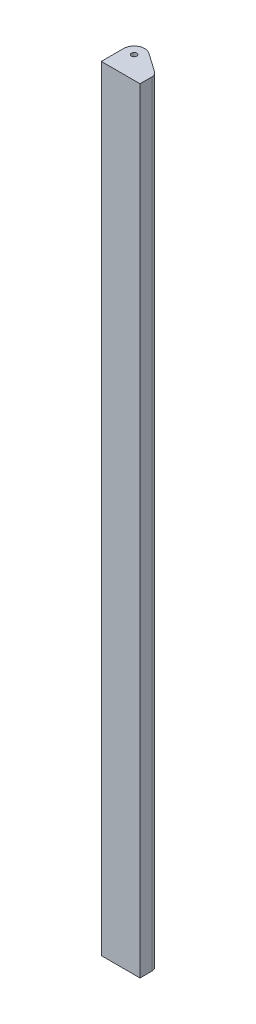
ISO-10303-21;
HEADER;
FILE_DESCRIPTION(('STEP AP214'),'2;1');
FILE_NAME('part.step','',(''),(''),'','','');
FILE_SCHEMA(('AUTOMOTIVE_DESIGN { 1 0 10303 214 1 1 1 1 }'));
ENDSEC;
DATA;
#1=APPLICATION_CONTEXT('core data for automotive mechanical design processes');
#2=APPLICATION_PROTOCOL_DEFINITION('international standard','automotive_design',2000,#1);
#3=PRODUCT_CONTEXT('',#1,'mechanical');
#4=PRODUCT('Part','Part','',(#3));
#5=PRODUCT_RELATED_PRODUCT_CATEGORY('part','',(#4));
#6=PRODUCT_DEFINITION_FORMATION('','',#4);
#7=PRODUCT_DEFINITION_CONTEXT('part definition',#1,'design');
#8=PRODUCT_DEFINITION('design','',#6,#7);
#9=PRODUCT_DEFINITION_SHAPE('','',#8);
#10=(LENGTH_UNIT() NAMED_UNIT(*) SI_UNIT(.MILLI.,.METRE.));
#11=(NAMED_UNIT(*) PLANE_ANGLE_UNIT() SI_UNIT($,.RADIAN.));
#12=(NAMED_UNIT(*) SI_UNIT($,.STERADIAN.) SOLID_ANGLE_UNIT());
#13=UNCERTAINTY_MEASURE_WITH_UNIT(LENGTH_MEASURE(1.E-05),#10,'distance_accuracy_value','');
#14=(GEOMETRIC_REPRESENTATION_CONTEXT(3) GLOBAL_UNCERTAINTY_ASSIGNED_CONTEXT((#13)) GLOBAL_UNIT_ASSIGNED_CONTEXT((#10,
#11,#12)) REPRESENTATION_CONTEXT('',''));
#15=CARTESIAN_POINT('',(0.,0.,0.));
#16=DIRECTION('',(0.,0.,1.));
#17=DIRECTION('',(1.,0.,0.));
#18=AXIS2_PLACEMENT_3D('',#15,#16,#17);
#19=CARTESIAN_POINT('',(19.05,1397.,-40.2442440840944));
#20=DIRECTION('',(0.,-1.,0.));
#21=DIRECTION('',(0.,0.,-1.));
#22=AXIS2_PLACEMENT_3D('',#19,#20,#21);
#23=CYLINDRICAL_SURFACE('',#22,19.05);
#24=CARTESIAN_POINT('',(19.05,0.,-40.2442440840944));
#25=DIRECTION('',(0.,1.,0.));
#26=DIRECTION('',(0.,0.,1.));
#27=AXIS2_PLACEMENT_3D('',#24,#25,#26);
#28=CIRCLE('',#27,19.05);
#29=CARTESIAN_POINT('',(29.9766311124874,0.,-55.8490905277997));
#30=VERTEX_POINT('',#29);
#31=CARTESIAN_POINT('',(1.28369537222284E-13,0.,-40.2442440840944));
#32=VERTEX_POINT('',#31);
#33=EDGE_CURVE('E136',#30,#32,#28,.T.);
#34=ORIENTED_EDGE('',*,*,#33,.T.);
#35=DIRECTION('',(0.,-1.,0.));
#36=VECTOR('',#35,1.);
#37=CARTESIAN_POINT('',(1.28369537222284E-13,1397.,-40.2442440840944));
#38=LINE('',#37,#36);
#39=CARTESIAN_POINT('',(1.28369537222284E-13,1397.,-40.2442440840944));
#40=VERTEX_POINT('',#39);
#41=EDGE_CURVE('E11',#40,#32,#38,.T.);
#42=ORIENTED_EDGE('',*,*,#41,.F.);
#43=CARTESIAN_POINT('',(19.05,1397.,-40.2442440840944));
#44=DIRECTION('',(0.,1.,0.));
#45=DIRECTION('',(0.,0.,1.));
#46=AXIS2_PLACEMENT_3D('',#43,#44,#45);
#47=CIRCLE('',#46,19.05);
#48=CARTESIAN_POINT('',(29.9766311124874,1397.,-55.8490905277997));
#49=VERTEX_POINT('',#48);
#50=EDGE_CURVE('E170',#49,#40,#47,.T.);
#51=ORIENTED_EDGE('',*,*,#50,.F.);
#52=DIRECTION('',(0.,-1.,0.));
#53=VECTOR('',#52,1.);
#54=CARTESIAN_POINT('',(29.9766311124874,1397.,-55.8490905277997));
#55=LINE('',#54,#53);
#56=EDGE_CURVE('E131',#49,#30,#55,.T.);
#57=ORIENTED_EDGE('',*,*,#56,.T.);
#58=EDGE_LOOP('',(#34,#42,#51,#57));
#59=FACE_BOUND('',#58,.T.);
#60=ADVANCED_FACE('F41',(#59),#23,.T.);
#61=CARTESIAN_POINT('',(0.,1397.,0.));
#62=DIRECTION('',(1.,0.,0.));
#63=DIRECTION('',(0.,0.,-1.));
#64=AXIS2_PLACEMENT_3D('',#61,#62,#63);
#65=PLANE('',#64);
#66=DIRECTION('',(0.,0.,1.));
#67=VECTOR('',#66,1.);
#68=CARTESIAN_POINT('',(0.,0.,0.));
#69=LINE('',#68,#67);
#70=CARTESIAN_POINT('',(0.,0.,0.));
#71=VERTEX_POINT('',#70);
#72=EDGE_CURVE('E140',#32,#71,#69,.T.);
#73=ORIENTED_EDGE('',*,*,#72,.T.);
#74=DIRECTION('',(0.,-1.,0.));
#75=VECTOR('',#74,1.);
#76=CARTESIAN_POINT('',(0.,1397.,0.));
#77=LINE('',#76,#75);
#78=CARTESIAN_POINT('',(0.,1397.,0.));
#79=VERTEX_POINT('',#78);
#80=EDGE_CURVE('E51',#79,#71,#77,.T.);
#81=ORIENTED_EDGE('',*,*,#80,.F.);
#82=DIRECTION('',(0.,0.,1.));
#83=VECTOR('',#82,1.);
#84=CARTESIAN_POINT('',(0.,1397.,0.));
#85=LINE('',#84,#83);
#86=EDGE_CURVE('E95',#40,#79,#85,.T.);
#87=ORIENTED_EDGE('',*,*,#86,.F.);
#88=ORIENTED_EDGE('',*,*,#41,.T.);
#89=EDGE_LOOP('',(#73,#81,#87,#88));
#90=FACE_BOUND('',#89,.T.);
#91=ADVANCED_FACE('F184',(#90),#65,.F.);
#92=CARTESIAN_POINT('',(0.,1397.,0.));
#93=DIRECTION('',(0.,0.,-1.));
#94=DIRECTION('',(-1.,0.,0.));
#95=AXIS2_PLACEMENT_3D('',#92,#93,#94);
#96=PLANE('',#95);
#97=DIRECTION('',(1.,0.,0.));
#98=VECTOR('',#97,1.);
#99=CARTESIAN_POINT('',(0.,0.,0.));
#100=LINE('',#99,#98);
#101=CARTESIAN_POINT('',(69.85,0.,0.));
#102=VERTEX_POINT('',#101);
#103=EDGE_CURVE('E143',#71,#102,#100,.T.);
#104=ORIENTED_EDGE('',*,*,#103,.T.);
#105=DIRECTION('',(0.,-1.,0.));
#106=VECTOR('',#105,1.);
#107=CARTESIAN_POINT('',(69.85,1397.,0.));
#108=LINE('',#107,#106);
#109=CARTESIAN_POINT('',(69.85,1397.,0.));
#110=VERTEX_POINT('',#109);
#111=EDGE_CURVE('E112',#110,#102,#108,.T.);
#112=ORIENTED_EDGE('',*,*,#111,.F.);
#113=DIRECTION('',(1.,0.,0.));
#114=VECTOR('',#113,1.);
#115=CARTESIAN_POINT('',(0.,1397.,0.));
#116=LINE('',#115,#114);
#117=EDGE_CURVE('E121',#79,#110,#116,.T.);
#118=ORIENTED_EDGE('',*,*,#117,.F.);
#119=ORIENTED_EDGE('',*,*,#80,.T.);
#120=EDGE_LOOP('',(#104,#112,#118,#119));
#121=FACE_BOUND('',#120,.T.);
#122=ADVANCED_FACE('F163',(#121),#96,.F.);
#123=CARTESIAN_POINT('',(69.85,1397.,0.));
#124=DIRECTION('',(1.,0.,0.));
#125=DIRECTION('',(0.,0.,-1.));
#126=AXIS2_PLACEMENT_3D('',#123,#124,#125);
#127=PLANE('',#126);
#128=DIRECTION('',(0.,0.,1.));
#129=VECTOR('',#128,1.);
#130=CARTESIAN_POINT('',(69.85,0.,0.));
#131=LINE('',#130,#129);
#132=CARTESIAN_POINT('',(69.85,0.,-21.31825551694));
#133=VERTEX_POINT('',#132);
#134=EDGE_CURVE('E110',#133,#102,#131,.T.);
#135=ORIENTED_EDGE('',*,*,#134,.F.);
#136=DIRECTION('',(0.,-1.,0.));
#137=VECTOR('',#136,1.);
#138=CARTESIAN_POINT('',(69.85,1397.,-21.31825551694));
#139=LINE('',#138,#137);
#140=CARTESIAN_POINT('',(69.85,1397.,-21.31825551694));
#141=VERTEX_POINT('',#140);
#142=EDGE_CURVE('E104',#141,#133,#139,.T.);
#143=ORIENTED_EDGE('',*,*,#142,.F.);
#144=DIRECTION('',(0.,0.,1.));
#145=VECTOR('',#144,1.);
#146=CARTESIAN_POINT('',(69.85,1397.,0.));
#147=LINE('',#146,#145);
#148=EDGE_CURVE('E108',#141,#110,#147,.T.);
#149=ORIENTED_EDGE('',*,*,#148,.T.);
#150=ORIENTED_EDGE('',*,*,#111,.T.);
#151=EDGE_LOOP('',(#135,#143,#149,#150));
#152=FACE_BOUND('',#151,.T.);
#153=ADVANCED_FACE('F106',(#152),#127,.T.);
#154=CARTESIAN_POINT('',(57.15,1397.,-21.31825551694));
#155=DIRECTION('',(0.,-1.,0.));
#156=DIRECTION('',(0.,0.,-1.));
#157=AXIS2_PLACEMENT_3D('',#154,#155,#156);
#158=CYLINDRICAL_SURFACE('',#157,12.7);
#159=CARTESIAN_POINT('',(57.15,0.,-21.31825551694));
#160=DIRECTION('',(0.,1.,0.));
#161=DIRECTION('',(0.,0.,1.));
#162=AXIS2_PLACEMENT_3D('',#159,#160,#161);
#163=CIRCLE('',#162,12.7);
#164=CARTESIAN_POINT('',(64.4344207416582,0.,-31.7214864794102));
#165=VERTEX_POINT('',#164);
#166=EDGE_CURVE('E81',#133,#165,#163,.T.);
#167=ORIENTED_EDGE('',*,*,#166,.T.);
#168=DIRECTION('',(0.,-1.,0.));
#169=VECTOR('',#168,1.);
#170=CARTESIAN_POINT('',(64.4344207416582,1397.,-31.7214864794102));
#171=LINE('',#170,#169);
#172=CARTESIAN_POINT('',(64.4344207416582,1397.,-31.7214864794102));
#173=VERTEX_POINT('',#172);
#174=EDGE_CURVE('E113',#173,#165,#171,.T.);
#175=ORIENTED_EDGE('',*,*,#174,.F.);
#176=CARTESIAN_POINT('',(57.15,1397.,-21.31825551694));
#177=DIRECTION('',(0.,1.,0.));
#178=DIRECTION('',(0.,0.,1.));
#179=AXIS2_PLACEMENT_3D('',#176,#177,#178);
#180=CIRCLE('',#179,12.7);
#181=EDGE_CURVE('E115',#141,#173,#180,.T.);
#182=ORIENTED_EDGE('',*,*,#181,.F.);
#183=ORIENTED_EDGE('',*,*,#142,.T.);
#184=EDGE_LOOP('',(#167,#175,#182,#183));
#185=FACE_BOUND('',#184,.T.);
#186=ADVANCED_FACE('F116',(#185),#158,.T.);
#187=CARTESIAN_POINT('',(19.05,1397.,-40.2442440840944));
#188=DIRECTION('',(0.,-1.,0.));
#189=DIRECTION('',(0.,0.,-1.));
#190=AXIS2_PLACEMENT_3D('',#187,#188,#189);
#191=CYLINDRICAL_SURFACE('',#190,4.7625);
#192=CARTESIAN_POINT('',(19.05,1397.,-40.2442440840944));
#193=DIRECTION('',(0.,1.,0.));
#194=DIRECTION('',(0.,0.,1.));
#195=AXIS2_PLACEMENT_3D('',#192,#193,#194);
#196=CIRCLE('',#195,4.7625);
#197=CARTESIAN_POINT('',(19.05,1397.,-35.4817440840944));
#198=VERTEX_POINT('',#197);
#199=EDGE_CURVE('E153',#198,#198,#196,.T.);
#200=ORIENTED_EDGE('',*,*,#199,.T.);
#201=EDGE_LOOP('',(#200));
#202=FACE_BOUND('',#201,.T.);
#203=CARTESIAN_POINT('',(19.05,0.,-40.2442440840944));
#204=DIRECTION('',(0.,1.,0.));
#205=DIRECTION('',(0.,0.,1.));
#206=AXIS2_PLACEMENT_3D('',#203,#204,#205);
#207=CIRCLE('',#206,4.7625);
#208=CARTESIAN_POINT('',(19.05,0.,-35.4817440840944));
#209=VERTEX_POINT('',#208);
#210=EDGE_CURVE('E132',#209,#209,#207,.T.);
#211=ORIENTED_EDGE('',*,*,#210,.F.);
#212=EDGE_LOOP('',(#211));
#213=FACE_BOUND('',#212,.T.);
#214=ADVANCED_FACE('F43',(#202,#213),#191,.F.);
#215=CARTESIAN_POINT('',(36.1024988447754,1397.,-51.5597117635761));
#216=DIRECTION('',(-0.573576436351041,0.,0.819152044288995));
#217=DIRECTION('',(0.819152044288995,0.,0.573576436351041));
#218=AXIS2_PLACEMENT_3D('',#215,#216,#217);
#219=PLANE('',#218);
#220=DIRECTION('',(-0.819152044288995,0.,-0.573576436351041));
#221=VECTOR('',#220,1.);
#222=CARTESIAN_POINT('',(36.1024988447754,0.,-51.5597117635761));
#223=LINE('',#222,#221);
#224=EDGE_CURVE('E87',#165,#30,#223,.T.);
#225=ORIENTED_EDGE('',*,*,#224,.T.);
#226=ORIENTED_EDGE('',*,*,#56,.F.);
#227=DIRECTION('',(-0.819152044288995,0.,-0.573576436351041));
#228=VECTOR('',#227,1.);
#229=CARTESIAN_POINT('',(36.1024988447754,1397.,-51.5597117635761));
#230=LINE('',#229,#228);
#231=EDGE_CURVE('E59',#173,#49,#230,.T.);
#232=ORIENTED_EDGE('',*,*,#231,.F.);
#233=ORIENTED_EDGE('',*,*,#174,.T.);
#234=EDGE_LOOP('',(#225,#226,#232,#233));
#235=FACE_BOUND('',#234,.T.);
#236=ADVANCED_FACE('F171',(#235),#219,.F.);
#237=CARTESIAN_POINT('',(0.,1397.,0.));
#238=DIRECTION('',(0.,1.,0.));
#239=DIRECTION('',(0.,0.,1.));
#240=AXIS2_PLACEMENT_3D('',#237,#238,#239);
#241=PLANE('',#240);
#242=ORIENTED_EDGE('',*,*,#199,.F.);
#243=EDGE_LOOP('',(#242));
#244=FACE_BOUND('',#243,.T.);
#245=ORIENTED_EDGE('',*,*,#50,.T.);
#246=ORIENTED_EDGE('',*,*,#86,.T.);
#247=ORIENTED_EDGE('',*,*,#117,.T.);
#248=ORIENTED_EDGE('',*,*,#148,.F.);
#249=ORIENTED_EDGE('',*,*,#181,.T.);
#250=ORIENTED_EDGE('',*,*,#231,.T.);
#251=EDGE_LOOP('',(#245,#246,#247,#248,#249,#250));
#252=FACE_BOUND('',#251,.T.);
#253=ADVANCED_FACE('F119',(#244,#252),#241,.T.);
#254=CARTESIAN_POINT('',(0.,0.,0.));
#255=DIRECTION('',(0.,1.,0.));
#256=DIRECTION('',(0.,0.,1.));
#257=AXIS2_PLACEMENT_3D('',#254,#255,#256);
#258=PLANE('',#257);
#259=ORIENTED_EDGE('',*,*,#210,.T.);
#260=EDGE_LOOP('',(#259));
#261=FACE_BOUND('',#260,.T.);
#262=ORIENTED_EDGE('',*,*,#33,.F.);
#263=ORIENTED_EDGE('',*,*,#224,.F.);
#264=ORIENTED_EDGE('',*,*,#166,.F.);
#265=ORIENTED_EDGE('',*,*,#134,.T.);
#266=ORIENTED_EDGE('',*,*,#103,.F.);
#267=ORIENTED_EDGE('',*,*,#72,.F.);
#268=EDGE_LOOP('',(#262,#263,#264,#265,#266,#267));
#269=FACE_BOUND('',#268,.T.);
#270=ADVANCED_FACE('F166',(#261,#269),#258,.F.);
#271=CLOSED_SHELL('',(#60,#91,#122,#153,#186,#214,#236,#253,#270));
#272=MANIFOLD_SOLID_BREP('B2',#271);
#273=ADVANCED_BREP_SHAPE_REPRESENTATION('',(#18,#272),#14);
#274=SHAPE_DEFINITION_REPRESENTATION(#9,#273);
ENDSEC;
END-ISO-10303-21;
